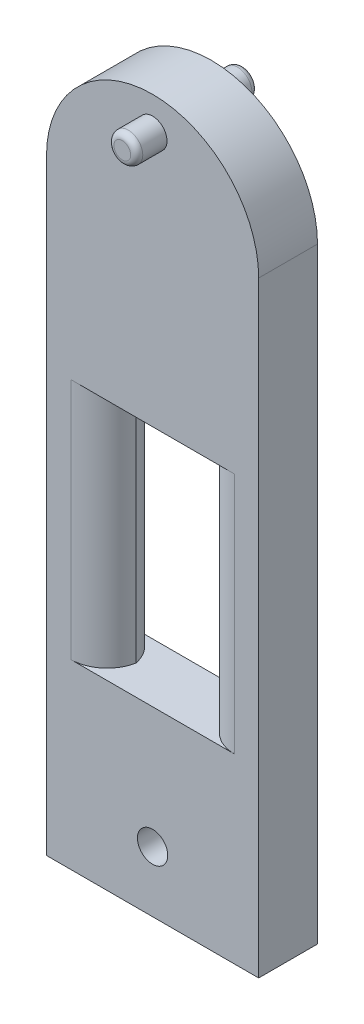
ISO-10303-21;
HEADER;
FILE_DESCRIPTION(('STEP AP214'),'2;1');
FILE_NAME('part.step','',(''),(''),'','','');
FILE_SCHEMA(('AUTOMOTIVE_DESIGN { 1 0 10303 214 1 1 1 1 }'));
ENDSEC;
DATA;
#1=APPLICATION_CONTEXT('core data for automotive mechanical design processes');
#2=APPLICATION_PROTOCOL_DEFINITION('international standard','automotive_design',2000,#1);
#3=PRODUCT_CONTEXT('',#1,'mechanical');
#4=PRODUCT('Part','Part','',(#3));
#5=PRODUCT_RELATED_PRODUCT_CATEGORY('part','',(#4));
#6=PRODUCT_DEFINITION_FORMATION('','',#4);
#7=PRODUCT_DEFINITION_CONTEXT('part definition',#1,'design');
#8=PRODUCT_DEFINITION('design','',#6,#7);
#9=PRODUCT_DEFINITION_SHAPE('','',#8);
#10=(LENGTH_UNIT() NAMED_UNIT(*) SI_UNIT(.MILLI.,.METRE.));
#11=(NAMED_UNIT(*) PLANE_ANGLE_UNIT() SI_UNIT($,.RADIAN.));
#12=(NAMED_UNIT(*) SI_UNIT($,.STERADIAN.) SOLID_ANGLE_UNIT());
#13=UNCERTAINTY_MEASURE_WITH_UNIT(LENGTH_MEASURE(1.E-05),#10,'distance_accuracy_value','');
#14=(GEOMETRIC_REPRESENTATION_CONTEXT(3) GLOBAL_UNCERTAINTY_ASSIGNED_CONTEXT((#13)) GLOBAL_UNIT_ASSIGNED_CONTEXT((#10,
#11,#12)) REPRESENTATION_CONTEXT('',''));
#15=CARTESIAN_POINT('',(0.,0.,0.));
#16=DIRECTION('',(0.,0.,1.));
#17=DIRECTION('',(1.,0.,0.));
#18=AXIS2_PLACEMENT_3D('',#15,#16,#17);
#19=CARTESIAN_POINT('',(0.,20.,9.7));
#20=DIRECTION('',(0.,1.,0.));
#21=DIRECTION('',(0.,0.,1.));
#22=AXIS2_PLACEMENT_3D('',#19,#20,#21);
#23=PLANE('',#22);
#24=DIRECTION('',(1.,0.,0.));
#25=VECTOR('',#24,1.);
#26=CARTESIAN_POINT('',(0.,20.,0.));
#27=LINE('',#26,#25);
#28=CARTESIAN_POINT('',(-13.5,20.,0.));
#29=VERTEX_POINT('',#28);
#30=CARTESIAN_POINT('',(13.5,20.,0.));
#31=VERTEX_POINT('',#30);
#32=EDGE_CURVE('E188',#29,#31,#27,.T.);
#33=ORIENTED_EDGE('',*,*,#32,.T.);
#34=CARTESIAN_POINT('',(13.5,20.,6.));
#35=DIRECTION('',(0.,1.,0.));
#36=DIRECTION('',(0.,0.,1.));
#37=AXIS2_PLACEMENT_3D('',#34,#35,#36);
#38=CIRCLE('',#37,6.);
#39=CARTESIAN_POINT('',(7.61123951921967,20.,4.85));
#40=VERTEX_POINT('',#39);
#41=EDGE_CURVE('E241',#31,#40,#38,.T.);
#42=ORIENTED_EDGE('',*,*,#41,.T.);
#43=CARTESIAN_POINT('',(13.5,20.,3.7));
#44=DIRECTION('',(0.,1.,0.));
#45=DIRECTION('',(0.,0.,1.));
#46=AXIS2_PLACEMENT_3D('',#43,#44,#45);
#47=CIRCLE('',#46,6.);
#48=CARTESIAN_POINT('',(13.5,20.,9.7));
#49=VERTEX_POINT('',#48);
#50=EDGE_CURVE('E247',#40,#49,#47,.T.);
#51=ORIENTED_EDGE('',*,*,#50,.T.);
#52=DIRECTION('',(1.,0.,0.));
#53=VECTOR('',#52,1.);
#54=CARTESIAN_POINT('',(0.,20.,9.7));
#55=LINE('',#54,#53);
#56=CARTESIAN_POINT('',(-13.5,20.,9.7));
#57=VERTEX_POINT('',#56);
#58=EDGE_CURVE('E163',#57,#49,#55,.T.);
#59=ORIENTED_EDGE('',*,*,#58,.F.);
#60=CARTESIAN_POINT('',(-13.5,20.,3.7));
#61=DIRECTION('',(0.,1.,0.));
#62=DIRECTION('',(0.,0.,1.));
#63=AXIS2_PLACEMENT_3D('',#60,#61,#62);
#64=CIRCLE('',#63,6.);
#65=CARTESIAN_POINT('',(-7.6112395192197,20.,4.85));
#66=VERTEX_POINT('',#65);
#67=EDGE_CURVE('E64',#57,#66,#64,.T.);
#68=ORIENTED_EDGE('',*,*,#67,.T.);
#69=CARTESIAN_POINT('',(-13.5,20.,6.));
#70=DIRECTION('',(0.,1.,0.));
#71=DIRECTION('',(0.,0.,1.));
#72=AXIS2_PLACEMENT_3D('',#69,#70,#71);
#73=CIRCLE('',#72,6.);
#74=EDGE_CURVE('E11',#66,#29,#73,.T.);
#75=ORIENTED_EDGE('',*,*,#74,.T.);
#76=EDGE_LOOP('',(#33,#42,#51,#59,#68,#75));
#77=FACE_BOUND('',#76,.T.);
#78=ADVANCED_FACE('F47',(#77),#23,.F.);
#79=CARTESIAN_POINT('',(0.,-20.,9.7));
#80=DIRECTION('',(0.,1.,0.));
#81=DIRECTION('',(0.,0.,1.));
#82=AXIS2_PLACEMENT_3D('',#79,#80,#81);
#83=PLANE('',#82);
#84=DIRECTION('',(1.,0.,0.));
#85=VECTOR('',#84,1.);
#86=CARTESIAN_POINT('',(0.,-20.,0.));
#87=LINE('',#86,#85);
#88=CARTESIAN_POINT('',(-13.5,-20.,0.));
#89=VERTEX_POINT('',#88);
#90=CARTESIAN_POINT('',(13.5,-20.,0.));
#91=VERTEX_POINT('',#90);
#92=EDGE_CURVE('E191',#89,#91,#87,.T.);
#93=ORIENTED_EDGE('',*,*,#92,.F.);
#94=CARTESIAN_POINT('',(-13.5,-20.,6.));
#95=DIRECTION('',(0.,1.,0.));
#96=DIRECTION('',(0.,0.,1.));
#97=AXIS2_PLACEMENT_3D('',#94,#95,#96);
#98=CIRCLE('',#97,6.);
#99=CARTESIAN_POINT('',(-7.6112395192197,-20.,4.85));
#100=VERTEX_POINT('',#99);
#101=EDGE_CURVE('E57',#89,#100,#98,.F.);
#102=ORIENTED_EDGE('',*,*,#101,.T.);
#103=CARTESIAN_POINT('',(-13.5,-20.,3.7));
#104=DIRECTION('',(0.,1.,0.));
#105=DIRECTION('',(0.,0.,1.));
#106=AXIS2_PLACEMENT_3D('',#103,#104,#105);
#107=CIRCLE('',#106,6.);
#108=CARTESIAN_POINT('',(-13.5,-20.,9.7));
#109=VERTEX_POINT('',#108);
#110=EDGE_CURVE('E251',#100,#109,#107,.F.);
#111=ORIENTED_EDGE('',*,*,#110,.T.);
#112=DIRECTION('',(1.,0.,0.));
#113=VECTOR('',#112,1.);
#114=CARTESIAN_POINT('',(0.,-20.,9.7));
#115=LINE('',#114,#113);
#116=CARTESIAN_POINT('',(13.5,-20.,9.7));
#117=VERTEX_POINT('',#116);
#118=EDGE_CURVE('E166',#109,#117,#115,.T.);
#119=ORIENTED_EDGE('',*,*,#118,.T.);
#120=CARTESIAN_POINT('',(13.5,-20.,3.7));
#121=DIRECTION('',(0.,1.,0.));
#122=DIRECTION('',(0.,0.,1.));
#123=AXIS2_PLACEMENT_3D('',#120,#121,#122);
#124=CIRCLE('',#123,6.);
#125=CARTESIAN_POINT('',(7.61123951921967,-20.,4.85));
#126=VERTEX_POINT('',#125);
#127=EDGE_CURVE('E244',#117,#126,#124,.F.);
#128=ORIENTED_EDGE('',*,*,#127,.T.);
#129=CARTESIAN_POINT('',(13.5,-20.,6.));
#130=DIRECTION('',(0.,1.,0.));
#131=DIRECTION('',(0.,0.,1.));
#132=AXIS2_PLACEMENT_3D('',#129,#130,#131);
#133=CIRCLE('',#132,6.);
#134=EDGE_CURVE('E237',#126,#91,#133,.F.);
#135=ORIENTED_EDGE('',*,*,#134,.T.);
#136=EDGE_LOOP('',(#93,#102,#111,#119,#128,#135));
#137=FACE_BOUND('',#136,.T.);
#138=ADVANCED_FACE('F280',(#137),#83,.T.);
#139=CARTESIAN_POINT('',(17.5,0.,9.7));
#140=DIRECTION('',(1.,0.,0.));
#141=DIRECTION('',(0.,0.,-1.));
#142=AXIS2_PLACEMENT_3D('',#139,#140,#141);
#143=PLANE('',#142);
#144=DIRECTION('',(0.,-1.,0.));
#145=VECTOR('',#144,1.);
#146=CARTESIAN_POINT('',(17.5,0.,0.));
#147=LINE('',#146,#145);
#148=CARTESIAN_POINT('',(17.5,50.,0.));
#149=VERTEX_POINT('',#148);
#150=CARTESIAN_POINT('',(17.5,-50.,0.));
#151=VERTEX_POINT('',#150);
#152=EDGE_CURVE('E132',#149,#151,#147,.T.);
#153=ORIENTED_EDGE('',*,*,#152,.F.);
#154=DIRECTION('',(0.,0.,-1.));
#155=VECTOR('',#154,1.);
#156=CARTESIAN_POINT('',(17.5,50.,9.7));
#157=LINE('',#156,#155);
#158=CARTESIAN_POINT('',(17.5,50.,9.7));
#159=VERTEX_POINT('',#158);
#160=EDGE_CURVE('E127',#159,#149,#157,.T.);
#161=ORIENTED_EDGE('',*,*,#160,.F.);
#162=DIRECTION('',(0.,-1.,0.));
#163=VECTOR('',#162,1.);
#164=CARTESIAN_POINT('',(17.5,0.,9.7));
#165=LINE('',#164,#163);
#166=CARTESIAN_POINT('',(17.5,-50.,9.7));
#167=VERTEX_POINT('',#166);
#168=EDGE_CURVE('E130',#159,#167,#165,.T.);
#169=ORIENTED_EDGE('',*,*,#168,.T.);
#170=DIRECTION('',(0.,0.,-1.));
#171=VECTOR('',#170,1.);
#172=CARTESIAN_POINT('',(17.5,-50.,9.7));
#173=LINE('',#172,#171);
#174=EDGE_CURVE('E169',#167,#151,#173,.T.);
#175=ORIENTED_EDGE('',*,*,#174,.T.);
#176=EDGE_LOOP('',(#153,#161,#169,#175));
#177=FACE_BOUND('',#176,.T.);
#178=ADVANCED_FACE('F129',(#177),#143,.T.);
#179=CARTESIAN_POINT('',(0.,50.,9.7));
#180=DIRECTION('',(0.,0.,-1.));
#181=DIRECTION('',(-1.,0.,0.));
#182=AXIS2_PLACEMENT_3D('',#179,#180,#181);
#183=CYLINDRICAL_SURFACE('',#182,17.5);
#184=CARTESIAN_POINT('',(0.,50.,0.));
#185=DIRECTION('',(0.,0.,1.));
#186=DIRECTION('',(1.,0.,0.));
#187=AXIS2_PLACEMENT_3D('',#184,#185,#186);
#188=CIRCLE('',#187,17.5);
#189=CARTESIAN_POINT('',(-17.5,50.,0.));
#190=VERTEX_POINT('',#189);
#191=EDGE_CURVE('E177',#190,#149,#188,.F.);
#192=ORIENTED_EDGE('',*,*,#191,.F.);
#193=DIRECTION('',(0.,0.,-1.));
#194=VECTOR('',#193,1.);
#195=CARTESIAN_POINT('',(-17.5,50.,9.7));
#196=LINE('',#195,#194);
#197=CARTESIAN_POINT('',(-17.5,50.,9.7));
#198=VERTEX_POINT('',#197);
#199=EDGE_CURVE('E139',#198,#190,#196,.T.);
#200=ORIENTED_EDGE('',*,*,#199,.F.);
#201=CARTESIAN_POINT('',(0.,50.,9.7));
#202=DIRECTION('',(0.,0.,1.));
#203=DIRECTION('',(1.,0.,0.));
#204=AXIS2_PLACEMENT_3D('',#201,#202,#203);
#205=CIRCLE('',#204,17.5);
#206=EDGE_CURVE('E146',#198,#159,#205,.F.);
#207=ORIENTED_EDGE('',*,*,#206,.T.);
#208=ORIENTED_EDGE('',*,*,#160,.T.);
#209=EDGE_LOOP('',(#192,#200,#207,#208));
#210=FACE_BOUND('',#209,.T.);
#211=ADVANCED_FACE('F152',(#210),#183,.T.);
#212=CARTESIAN_POINT('',(-17.5,0.,9.7));
#213=DIRECTION('',(1.,0.,0.));
#214=DIRECTION('',(0.,0.,-1.));
#215=AXIS2_PLACEMENT_3D('',#212,#213,#214);
#216=PLANE('',#215);
#217=DIRECTION('',(0.,-1.,0.));
#218=VECTOR('',#217,1.);
#219=CARTESIAN_POINT('',(-17.5,0.,0.));
#220=LINE('',#219,#218);
#221=CARTESIAN_POINT('',(-17.5,-50.,0.));
#222=VERTEX_POINT('',#221);
#223=EDGE_CURVE('E180',#190,#222,#220,.T.);
#224=ORIENTED_EDGE('',*,*,#223,.T.);
#225=DIRECTION('',(0.,0.,-1.));
#226=VECTOR('',#225,1.);
#227=CARTESIAN_POINT('',(-17.5,-50.,9.7));
#228=LINE('',#227,#226);
#229=CARTESIAN_POINT('',(-17.5,-50.,9.7));
#230=VERTEX_POINT('',#229);
#231=EDGE_CURVE('E196',#230,#222,#228,.T.);
#232=ORIENTED_EDGE('',*,*,#231,.F.);
#233=DIRECTION('',(0.,-1.,0.));
#234=VECTOR('',#233,1.);
#235=CARTESIAN_POINT('',(-17.5,0.,9.7));
#236=LINE('',#235,#234);
#237=EDGE_CURVE('E155',#198,#230,#236,.T.);
#238=ORIENTED_EDGE('',*,*,#237,.F.);
#239=ORIENTED_EDGE('',*,*,#199,.T.);
#240=EDGE_LOOP('',(#224,#232,#238,#239));
#241=FACE_BOUND('',#240,.T.);
#242=ADVANCED_FACE('F311',(#241),#216,.F.);
#243=CARTESIAN_POINT('',(0.,-50.,9.7));
#244=DIRECTION('',(0.,1.,0.));
#245=DIRECTION('',(0.,0.,1.));
#246=AXIS2_PLACEMENT_3D('',#243,#244,#245);
#247=PLANE('',#246);
#248=DIRECTION('',(1.,0.,0.));
#249=VECTOR('',#248,1.);
#250=CARTESIAN_POINT('',(0.,-50.,0.));
#251=LINE('',#250,#249);
#252=EDGE_CURVE('E184',#222,#151,#251,.T.);
#253=ORIENTED_EDGE('',*,*,#252,.T.);
#254=ORIENTED_EDGE('',*,*,#174,.F.);
#255=DIRECTION('',(1.,0.,0.));
#256=VECTOR('',#255,1.);
#257=CARTESIAN_POINT('',(0.,-50.,9.7));
#258=LINE('',#257,#256);
#259=EDGE_CURVE('E147',#230,#167,#258,.T.);
#260=ORIENTED_EDGE('',*,*,#259,.F.);
#261=ORIENTED_EDGE('',*,*,#231,.T.);
#262=EDGE_LOOP('',(#253,#254,#260,#261));
#263=FACE_BOUND('',#262,.T.);
#264=ADVANCED_FACE('F297',(#263),#247,.F.);
#265=CARTESIAN_POINT('',(0.,-40.,9.7));
#266=DIRECTION('',(0.,0.,-1.));
#267=DIRECTION('',(-1.,0.,0.));
#268=AXIS2_PLACEMENT_3D('',#265,#266,#267);
#269=CYLINDRICAL_SURFACE('',#268,2.5);
#270=CARTESIAN_POINT('',(0.,-40.,9.7));
#271=DIRECTION('',(0.,0.,1.));
#272=DIRECTION('',(1.,0.,0.));
#273=AXIS2_PLACEMENT_3D('',#270,#271,#272);
#274=CIRCLE('',#273,2.5);
#275=CARTESIAN_POINT('',(2.5,-40.,9.7));
#276=VERTEX_POINT('',#275);
#277=EDGE_CURVE('E150',#276,#276,#274,.T.);
#278=ORIENTED_EDGE('',*,*,#277,.T.);
#279=EDGE_LOOP('',(#278));
#280=FACE_BOUND('',#279,.T.);
#281=CARTESIAN_POINT('',(0.,-40.,0.));
#282=DIRECTION('',(0.,0.,1.));
#283=DIRECTION('',(1.,0.,0.));
#284=AXIS2_PLACEMENT_3D('',#281,#282,#283);
#285=CIRCLE('',#284,2.5);
#286=CARTESIAN_POINT('',(2.5,-40.,0.));
#287=VERTEX_POINT('',#286);
#288=EDGE_CURVE('E170',#287,#287,#285,.T.);
#289=ORIENTED_EDGE('',*,*,#288,.F.);
#290=EDGE_LOOP('',(#289));
#291=FACE_BOUND('',#290,.T.);
#292=ADVANCED_FACE('F286',(#280,#291),#269,.F.);
#293=CARTESIAN_POINT('',(0.,0.,9.7));
#294=DIRECTION('',(0.,0.,1.));
#295=DIRECTION('',(1.,0.,0.));
#296=AXIS2_PLACEMENT_3D('',#293,#294,#295);
#297=PLANE('',#296);
#298=CARTESIAN_POINT('',(0.,62.,9.7));
#299=DIRECTION('',(0.,0.,1.));
#300=DIRECTION('',(1.,0.,0.));
#301=AXIS2_PLACEMENT_3D('',#298,#299,#300);
#302=CIRCLE('',#301,2.38);
#303=CARTESIAN_POINT('',(2.38,62.,9.7));
#304=VERTEX_POINT('',#303);
#305=EDGE_CURVE('E174',#304,#304,#302,.F.);
#306=ORIENTED_EDGE('',*,*,#305,.T.);
#307=EDGE_LOOP('',(#306));
#308=FACE_BOUND('',#307,.T.);
#309=ORIENTED_EDGE('',*,*,#277,.F.);
#310=EDGE_LOOP('',(#309));
#311=FACE_BOUND('',#310,.T.);
#312=ORIENTED_EDGE('',*,*,#168,.F.);
#313=ORIENTED_EDGE('',*,*,#206,.F.);
#314=ORIENTED_EDGE('',*,*,#237,.T.);
#315=ORIENTED_EDGE('',*,*,#259,.T.);
#316=EDGE_LOOP('',(#312,#313,#314,#315));
#317=FACE_BOUND('',#316,.T.);
#318=DIRECTION('',(0.,-1.,0.));
#319=VECTOR('',#318,1.);
#320=CARTESIAN_POINT('',(13.5,-20.,9.7));
#321=LINE('',#320,#319);
#322=EDGE_CURVE('E233',#49,#117,#321,.T.);
#323=ORIENTED_EDGE('',*,*,#322,.T.);
#324=ORIENTED_EDGE('',*,*,#118,.F.);
#325=DIRECTION('',(0.,-1.,0.));
#326=VECTOR('',#325,1.);
#327=CARTESIAN_POINT('',(-13.5,0.,9.7));
#328=LINE('',#327,#326);
#329=EDGE_CURVE('E229',#109,#57,#328,.F.);
#330=ORIENTED_EDGE('',*,*,#329,.T.);
#331=ORIENTED_EDGE('',*,*,#58,.T.);
#332=EDGE_LOOP('',(#323,#324,#330,#331));
#333=FACE_BOUND('',#332,.T.);
#334=ADVANCED_FACE('F143',(#308,#311,#317,#333),#297,.T.);
#335=CARTESIAN_POINT('',(0.,0.,0.));
#336=DIRECTION('',(0.,0.,1.));
#337=DIRECTION('',(1.,0.,0.));
#338=AXIS2_PLACEMENT_3D('',#335,#336,#337);
#339=PLANE('',#338);
#340=CARTESIAN_POINT('',(0.,62.,0.));
#341=DIRECTION('',(0.,0.,1.));
#342=DIRECTION('',(1.,0.,0.));
#343=AXIS2_PLACEMENT_3D('',#340,#341,#342);
#344=CIRCLE('',#343,2.38);
#345=CARTESIAN_POINT('',(2.38,62.,0.));
#346=VERTEX_POINT('',#345);
#347=EDGE_CURVE('E138',#346,#346,#344,.F.);
#348=ORIENTED_EDGE('',*,*,#347,.F.);
#349=EDGE_LOOP('',(#348));
#350=FACE_BOUND('',#349,.T.);
#351=ORIENTED_EDGE('',*,*,#288,.T.);
#352=EDGE_LOOP('',(#351));
#353=FACE_BOUND('',#352,.T.);
#354=ORIENTED_EDGE('',*,*,#152,.T.);
#355=ORIENTED_EDGE('',*,*,#252,.F.);
#356=ORIENTED_EDGE('',*,*,#223,.F.);
#357=ORIENTED_EDGE('',*,*,#191,.T.);
#358=EDGE_LOOP('',(#354,#355,#356,#357));
#359=FACE_BOUND('',#358,.T.);
#360=ORIENTED_EDGE('',*,*,#92,.T.);
#361=DIRECTION('',(0.,-1.,0.));
#362=VECTOR('',#361,1.);
#363=CARTESIAN_POINT('',(13.5,0.,0.));
#364=LINE('',#363,#362);
#365=EDGE_CURVE('E225',#91,#31,#364,.F.);
#366=ORIENTED_EDGE('',*,*,#365,.T.);
#367=ORIENTED_EDGE('',*,*,#32,.F.);
#368=DIRECTION('',(0.,-1.,0.));
#369=VECTOR('',#368,1.);
#370=CARTESIAN_POINT('',(-13.5,-20.,0.));
#371=LINE('',#370,#369);
#372=EDGE_CURVE('E221',#29,#89,#371,.T.);
#373=ORIENTED_EDGE('',*,*,#372,.T.);
#374=EDGE_LOOP('',(#360,#366,#367,#373));
#375=FACE_BOUND('',#374,.T.);
#376=ADVANCED_FACE('F279',(#350,#353,#359,#375),#339,.F.);
#377=CARTESIAN_POINT('',(0.,62.,-5.3));
#378=DIRECTION('',(0.,0.,1.));
#379=DIRECTION('',(1.,0.,0.));
#380=AXIS2_PLACEMENT_3D('',#377,#378,#379);
#381=PLANE('',#380);
#382=CARTESIAN_POINT('',(0.,62.,-5.3));
#383=DIRECTION('',(0.,0.,1.));
#384=DIRECTION('',(1.,0.,0.));
#385=AXIS2_PLACEMENT_3D('',#382,#383,#384);
#386=CIRCLE('',#385,1.38);
#387=CARTESIAN_POINT('',(1.38,62.,-5.3));
#388=VERTEX_POINT('',#387);
#389=EDGE_CURVE('E209',#388,#388,#386,.F.);
#390=ORIENTED_EDGE('',*,*,#389,.T.);
#391=EDGE_LOOP('',(#390));
#392=FACE_BOUND('',#391,.T.);
#393=ADVANCED_FACE('F293',(#392),#381,.F.);
#394=CARTESIAN_POINT('',(0.,62.,14.7));
#395=DIRECTION('',(0.,0.,-1.));
#396=DIRECTION('',(-1.,0.,0.));
#397=AXIS2_PLACEMENT_3D('',#394,#395,#396);
#398=CYLINDRICAL_SURFACE('',#397,2.38);
#399=CARTESIAN_POINT('',(0.,62.,-4.3));
#400=DIRECTION('',(0.,0.,1.));
#401=DIRECTION('',(1.,0.,0.));
#402=AXIS2_PLACEMENT_3D('',#399,#400,#401);
#403=CIRCLE('',#402,2.38);
#404=CARTESIAN_POINT('',(2.38,62.,-4.3));
#405=VERTEX_POINT('',#404);
#406=EDGE_CURVE('E205',#405,#405,#403,.T.);
#407=ORIENTED_EDGE('',*,*,#406,.T.);
#408=EDGE_LOOP('',(#407));
#409=FACE_BOUND('',#408,.T.);
#410=ORIENTED_EDGE('',*,*,#347,.T.);
#411=EDGE_LOOP('',(#410));
#412=FACE_BOUND('',#411,.T.);
#413=ADVANCED_FACE('F365',(#409,#412),#398,.T.);
#414=CARTESIAN_POINT('',(0.,62.,13.7));
#415=DIRECTION('',(0.,0.,1.));
#416=DIRECTION('',(1.,0.,0.));
#417=AXIS2_PLACEMENT_3D('',#414,#415,#416);
#418=CIRCLE('',#417,2.38);
#419=CARTESIAN_POINT('',(2.38,62.,13.7));
#420=VERTEX_POINT('',#419);
#421=EDGE_CURVE('E217',#420,#420,#418,.F.);
#422=ORIENTED_EDGE('',*,*,#421,.T.);
#423=EDGE_LOOP('',(#422));
#424=FACE_BOUND('',#423,.T.);
#425=ORIENTED_EDGE('',*,*,#305,.F.);
#426=EDGE_LOOP('',(#425));
#427=FACE_BOUND('',#426,.T.);
#428=ADVANCED_FACE('F375',(#424,#427),#398,.T.);
#429=CARTESIAN_POINT('',(0.,62.,14.7));
#430=DIRECTION('',(0.,0.,1.));
#431=DIRECTION('',(1.,0.,0.));
#432=AXIS2_PLACEMENT_3D('',#429,#430,#431);
#433=PLANE('',#432);
#434=CARTESIAN_POINT('',(0.,62.,14.7));
#435=DIRECTION('',(0.,0.,1.));
#436=DIRECTION('',(1.,0.,0.));
#437=AXIS2_PLACEMENT_3D('',#434,#435,#436);
#438=CIRCLE('',#437,1.38);
#439=CARTESIAN_POINT('',(1.38,62.,14.7));
#440=VERTEX_POINT('',#439);
#441=EDGE_CURVE('E213',#440,#440,#438,.T.);
#442=ORIENTED_EDGE('',*,*,#441,.T.);
#443=EDGE_LOOP('',(#442));
#444=FACE_BOUND('',#443,.T.);
#445=ADVANCED_FACE('F324',(#444),#433,.T.);
#446=CARTESIAN_POINT('',(0.,62.,-4.3));
#447=DIRECTION('',(0.,0.,1.));
#448=DIRECTION('',(1.,0.,0.));
#449=AXIS2_PLACEMENT_3D('',#446,#447,#448);
#450=TOROIDAL_SURFACE('',#449,1.38,1.);
#451=ORIENTED_EDGE('',*,*,#389,.F.);
#452=EDGE_LOOP('',(#451));
#453=FACE_BOUND('',#452,.T.);
#454=ORIENTED_EDGE('',*,*,#406,.F.);
#455=EDGE_LOOP('',(#454));
#456=FACE_BOUND('',#455,.T.);
#457=ADVANCED_FACE('F320',(#453,#456),#450,.T.);
#458=CARTESIAN_POINT('',(0.,62.,13.7));
#459=DIRECTION('',(0.,0.,1.));
#460=DIRECTION('',(1.,0.,0.));
#461=AXIS2_PLACEMENT_3D('',#458,#459,#460);
#462=TOROIDAL_SURFACE('',#461,1.38,1.);
#463=ORIENTED_EDGE('',*,*,#421,.F.);
#464=EDGE_LOOP('',(#463));
#465=FACE_BOUND('',#464,.T.);
#466=ORIENTED_EDGE('',*,*,#441,.F.);
#467=EDGE_LOOP('',(#466));
#468=FACE_BOUND('',#467,.T.);
#469=ADVANCED_FACE('F323',(#465,#468),#462,.T.);
#470=CARTESIAN_POINT('',(13.5,0.,3.7));
#471=DIRECTION('',(0.,1.,0.));
#472=DIRECTION('',(0.,0.,1.));
#473=AXIS2_PLACEMENT_3D('',#470,#471,#472);
#474=CYLINDRICAL_SURFACE('',#473,6.);
#475=ORIENTED_EDGE('',*,*,#322,.F.);
#476=ORIENTED_EDGE('',*,*,#50,.F.);
#477=DIRECTION('',(0.,1.,0.));
#478=VECTOR('',#477,1.);
#479=CARTESIAN_POINT('',(7.61123951921967,0.,4.85));
#480=LINE('',#479,#478);
#481=EDGE_CURVE('E257',#126,#40,#480,.T.);
#482=ORIENTED_EDGE('',*,*,#481,.F.);
#483=ORIENTED_EDGE('',*,*,#127,.F.);
#484=EDGE_LOOP('',(#475,#476,#482,#483));
#485=FACE_BOUND('',#484,.T.);
#486=ADVANCED_FACE('F284',(#485),#474,.T.);
#487=CARTESIAN_POINT('',(13.5,0.,6.));
#488=DIRECTION('',(0.,-1.,0.));
#489=DIRECTION('',(0.,0.,-1.));
#490=AXIS2_PLACEMENT_3D('',#487,#488,#489);
#491=CYLINDRICAL_SURFACE('',#490,6.);
#492=ORIENTED_EDGE('',*,*,#41,.F.);
#493=ORIENTED_EDGE('',*,*,#365,.F.);
#494=ORIENTED_EDGE('',*,*,#134,.F.);
#495=ORIENTED_EDGE('',*,*,#481,.T.);
#496=EDGE_LOOP('',(#492,#493,#494,#495));
#497=FACE_BOUND('',#496,.T.);
#498=ADVANCED_FACE('F278',(#497),#491,.T.);
#499=CARTESIAN_POINT('',(-13.5,0.,6.));
#500=DIRECTION('',(0.,1.,0.));
#501=DIRECTION('',(0.,0.,1.));
#502=AXIS2_PLACEMENT_3D('',#499,#500,#501);
#503=CYLINDRICAL_SURFACE('',#502,6.);
#504=ORIENTED_EDGE('',*,*,#372,.F.);
#505=ORIENTED_EDGE('',*,*,#74,.F.);
#506=DIRECTION('',(0.,1.,0.));
#507=VECTOR('',#506,1.);
#508=CARTESIAN_POINT('',(-7.6112395192197,0.,4.85));
#509=LINE('',#508,#507);
#510=EDGE_CURVE('E51',#100,#66,#509,.T.);
#511=ORIENTED_EDGE('',*,*,#510,.F.);
#512=ORIENTED_EDGE('',*,*,#101,.F.);
#513=EDGE_LOOP('',(#504,#505,#511,#512));
#514=FACE_BOUND('',#513,.T.);
#515=ADVANCED_FACE('F49',(#514),#503,.T.);
#516=CARTESIAN_POINT('',(-13.5,0.,3.7));
#517=DIRECTION('',(0.,-1.,0.));
#518=DIRECTION('',(0.,0.,-1.));
#519=AXIS2_PLACEMENT_3D('',#516,#517,#518);
#520=CYLINDRICAL_SURFACE('',#519,6.);
#521=ORIENTED_EDGE('',*,*,#67,.F.);
#522=ORIENTED_EDGE('',*,*,#329,.F.);
#523=ORIENTED_EDGE('',*,*,#110,.F.);
#524=ORIENTED_EDGE('',*,*,#510,.T.);
#525=EDGE_LOOP('',(#521,#522,#523,#524));
#526=FACE_BOUND('',#525,.T.);
#527=ADVANCED_FACE('F271',(#526),#520,.T.);
#528=CLOSED_SHELL('',(#78,#138,#178,#211,#242,#264,#292,#334,#376,#393,#413,#428,#445,#457,#469,
#486,#498,#515,#527));
#529=MANIFOLD_SOLID_BREP('B2',#528);
#530=ADVANCED_BREP_SHAPE_REPRESENTATION('',(#18,#529),#14);
#531=SHAPE_DEFINITION_REPRESENTATION(#9,#530);
ENDSEC;
END-ISO-10303-21;
